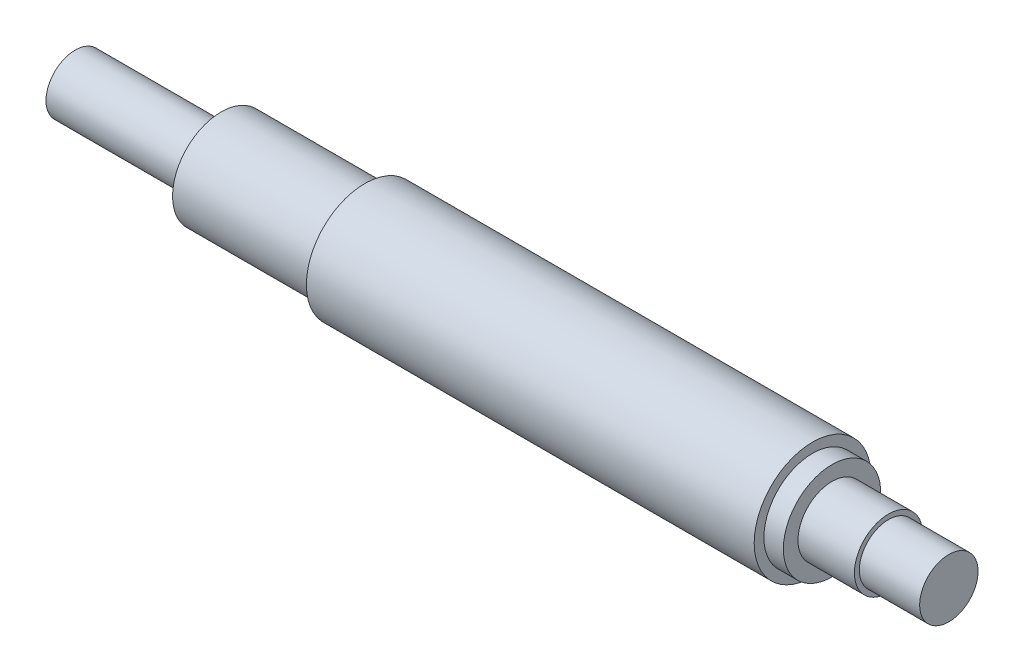
ISO-10303-21;
HEADER;
FILE_DESCRIPTION(('STEP AP214'),'2;1');
FILE_NAME('part.step','',(''),(''),'','','');
FILE_SCHEMA(('AUTOMOTIVE_DESIGN { 1 0 10303 214 1 1 1 1 }'));
ENDSEC;
DATA;
#1=APPLICATION_CONTEXT('core data for automotive mechanical design processes');
#2=APPLICATION_PROTOCOL_DEFINITION('international standard','automotive_design',2000,#1);
#3=PRODUCT_CONTEXT('',#1,'mechanical');
#4=PRODUCT('Part','Part','',(#3));
#5=PRODUCT_RELATED_PRODUCT_CATEGORY('part','',(#4));
#6=PRODUCT_DEFINITION_FORMATION('','',#4);
#7=PRODUCT_DEFINITION_CONTEXT('part definition',#1,'design');
#8=PRODUCT_DEFINITION('design','',#6,#7);
#9=PRODUCT_DEFINITION_SHAPE('','',#8);
#10=(LENGTH_UNIT() NAMED_UNIT(*) SI_UNIT(.MILLI.,.METRE.));
#11=(NAMED_UNIT(*) PLANE_ANGLE_UNIT() SI_UNIT($,.RADIAN.));
#12=(NAMED_UNIT(*) SI_UNIT($,.STERADIAN.) SOLID_ANGLE_UNIT());
#13=UNCERTAINTY_MEASURE_WITH_UNIT(LENGTH_MEASURE(1.E-05),#10,'distance_accuracy_value','');
#14=(GEOMETRIC_REPRESENTATION_CONTEXT(3) GLOBAL_UNCERTAINTY_ASSIGNED_CONTEXT((#13)) GLOBAL_UNIT_ASSIGNED_CONTEXT((#10,
#11,#12)) REPRESENTATION_CONTEXT('',''));
#15=CARTESIAN_POINT('',(0.,0.,0.));
#16=DIRECTION('',(0.,0.,1.));
#17=DIRECTION('',(1.,0.,0.));
#18=AXIS2_PLACEMENT_3D('',#15,#16,#17);
#19=CARTESIAN_POINT('',(-32.375,3.,0.));
#20=DIRECTION('',(1.,0.,0.));
#21=DIRECTION('',(0.,0.,-1.));
#22=AXIS2_PLACEMENT_3D('',#19,#20,#21);
#23=PLANE('',#22);
#24=CARTESIAN_POINT('',(-32.375,0.,0.));
#25=DIRECTION('',(-1.,0.,0.));
#26=DIRECTION('',(0.,0.,1.));
#27=AXIS2_PLACEMENT_3D('',#24,#25,#26);
#28=CIRCLE('',#27,3.);
#29=CARTESIAN_POINT('',(-32.375,0.,3.));
#30=VERTEX_POINT('',#29);
#31=EDGE_CURVE('E77',#30,#30,#28,.T.);
#32=ORIENTED_EDGE('',*,*,#31,.F.);
#33=EDGE_LOOP('',(#32));
#34=FACE_BOUND('',#33,.T.);
#35=CARTESIAN_POINT('',(-32.375,0.,0.));
#36=DIRECTION('',(-1.,0.,0.));
#37=DIRECTION('',(0.,0.,1.));
#38=AXIS2_PLACEMENT_3D('',#35,#36,#37);
#39=CIRCLE('',#38,5.);
#40=CARTESIAN_POINT('',(-32.375,0.,5.));
#41=VERTEX_POINT('',#40);
#42=EDGE_CURVE('E10',#41,#41,#39,.T.);
#43=ORIENTED_EDGE('',*,*,#42,.T.);
#44=EDGE_LOOP('',(#43));
#45=FACE_BOUND('',#44,.T.);
#46=ADVANCED_FACE('F40',(#34,#45),#23,.F.);
#47=CARTESIAN_POINT('',(-42.375,0.,0.));
#48=DIRECTION('',(-1.,0.,0.));
#49=DIRECTION('',(0.,0.,1.));
#50=AXIS2_PLACEMENT_3D('',#47,#48,#49);
#51=CYLINDRICAL_SURFACE('',#50,5.);
#52=ORIENTED_EDGE('',*,*,#42,.F.);
#53=EDGE_LOOP('',(#52));
#54=FACE_BOUND('',#53,.T.);
#55=CARTESIAN_POINT('',(-17.625,0.,0.));
#56=DIRECTION('',(-1.,0.,0.));
#57=DIRECTION('',(0.,0.,1.));
#58=AXIS2_PLACEMENT_3D('',#55,#56,#57);
#59=CIRCLE('',#58,5.);
#60=CARTESIAN_POINT('',(-17.625,0.,5.));
#61=VERTEX_POINT('',#60);
#62=EDGE_CURVE('E46',#61,#61,#59,.T.);
#63=ORIENTED_EDGE('',*,*,#62,.T.);
#64=EDGE_LOOP('',(#63));
#65=FACE_BOUND('',#64,.T.);
#66=ADVANCED_FACE('F100',(#54,#65),#51,.T.);
#67=CARTESIAN_POINT('',(-17.625,5.,0.));
#68=DIRECTION('',(1.,0.,0.));
#69=DIRECTION('',(0.,0.,-1.));
#70=AXIS2_PLACEMENT_3D('',#67,#68,#69);
#71=PLANE('',#70);
#72=ORIENTED_EDGE('',*,*,#62,.F.);
#73=EDGE_LOOP('',(#72));
#74=FACE_BOUND('',#73,.T.);
#75=CARTESIAN_POINT('',(-17.625,0.,0.));
#76=DIRECTION('',(-1.,0.,0.));
#77=DIRECTION('',(0.,0.,1.));
#78=AXIS2_PLACEMENT_3D('',#75,#76,#77);
#79=CIRCLE('',#78,6.);
#80=CARTESIAN_POINT('',(-17.625,0.,6.));
#81=VERTEX_POINT('',#80);
#82=EDGE_CURVE('E50',#81,#81,#79,.T.);
#83=ORIENTED_EDGE('',*,*,#82,.T.);
#84=EDGE_LOOP('',(#83));
#85=FACE_BOUND('',#84,.T.);
#86=ADVANCED_FACE('F105',(#74,#85),#71,.F.);
#87=CARTESIAN_POINT('',(-42.375,0.,0.));
#88=DIRECTION('',(-1.,0.,0.));
#89=DIRECTION('',(0.,0.,1.));
#90=AXIS2_PLACEMENT_3D('',#87,#88,#89);
#91=CYLINDRICAL_SURFACE('',#90,6.);
#92=ORIENTED_EDGE('',*,*,#82,.F.);
#93=EDGE_LOOP('',(#92));
#94=FACE_BOUND('',#93,.T.);
#95=CARTESIAN_POINT('',(28.375,0.,0.));
#96=DIRECTION('',(-1.,0.,0.));
#97=DIRECTION('',(0.,0.,1.));
#98=AXIS2_PLACEMENT_3D('',#95,#96,#97);
#99=CIRCLE('',#98,5.99999999999999);
#100=CARTESIAN_POINT('',(28.375,0.,5.99999999999999));
#101=VERTEX_POINT('',#100);
#102=EDGE_CURVE('E54',#101,#101,#99,.T.);
#103=ORIENTED_EDGE('',*,*,#102,.T.);
#104=EDGE_LOOP('',(#103));
#105=FACE_BOUND('',#104,.T.);
#106=ADVANCED_FACE('F111',(#94,#105),#91,.T.);
#107=CARTESIAN_POINT('',(28.375,5.99999999999999,0.));
#108=DIRECTION('',(-1.,0.,0.));
#109=DIRECTION('',(0.,0.,1.));
#110=AXIS2_PLACEMENT_3D('',#107,#108,#109);
#111=PLANE('',#110);
#112=ORIENTED_EDGE('',*,*,#102,.F.);
#113=EDGE_LOOP('',(#112));
#114=FACE_BOUND('',#113,.T.);
#115=CARTESIAN_POINT('',(28.375,0.,0.));
#116=DIRECTION('',(-1.,0.,0.));
#117=DIRECTION('',(0.,0.,1.));
#118=AXIS2_PLACEMENT_3D('',#115,#116,#117);
#119=CIRCLE('',#118,4.99999999999998);
#120=CARTESIAN_POINT('',(28.375,0.,4.99999999999998));
#121=VERTEX_POINT('',#120);
#122=EDGE_CURVE('E59',#121,#121,#119,.T.);
#123=ORIENTED_EDGE('',*,*,#122,.T.);
#124=EDGE_LOOP('',(#123));
#125=FACE_BOUND('',#124,.T.);
#126=ADVANCED_FACE('F117',(#114,#125),#111,.F.);
#127=CARTESIAN_POINT('',(-42.375,0.,0.));
#128=DIRECTION('',(-1.,0.,0.));
#129=DIRECTION('',(0.,0.,1.));
#130=AXIS2_PLACEMENT_3D('',#127,#128,#129);
#131=CYLINDRICAL_SURFACE('',#130,4.99999999999998);
#132=ORIENTED_EDGE('',*,*,#122,.F.);
#133=EDGE_LOOP('',(#132));
#134=FACE_BOUND('',#133,.T.);
#135=CARTESIAN_POINT('',(30.375,0.,0.));
#136=DIRECTION('',(-1.,0.,0.));
#137=DIRECTION('',(0.,0.,1.));
#138=AXIS2_PLACEMENT_3D('',#135,#136,#137);
#139=CIRCLE('',#138,4.99999999999998);
#140=CARTESIAN_POINT('',(30.375,0.,4.99999999999998));
#141=VERTEX_POINT('',#140);
#142=EDGE_CURVE('E62',#141,#141,#139,.T.);
#143=ORIENTED_EDGE('',*,*,#142,.T.);
#144=EDGE_LOOP('',(#143));
#145=FACE_BOUND('',#144,.T.);
#146=ADVANCED_FACE('F121',(#134,#145),#131,.T.);
#147=CARTESIAN_POINT('',(30.375,4.99999999999998,0.));
#148=DIRECTION('',(-1.,0.,0.));
#149=DIRECTION('',(0.,0.,1.));
#150=AXIS2_PLACEMENT_3D('',#147,#148,#149);
#151=PLANE('',#150);
#152=ORIENTED_EDGE('',*,*,#142,.F.);
#153=EDGE_LOOP('',(#152));
#154=FACE_BOUND('',#153,.T.);
#155=CARTESIAN_POINT('',(30.375,0.,0.));
#156=DIRECTION('',(-1.,0.,0.));
#157=DIRECTION('',(0.,0.,1.));
#158=AXIS2_PLACEMENT_3D('',#155,#156,#157);
#159=CIRCLE('',#158,3.49999999999999);
#160=CARTESIAN_POINT('',(30.375,0.,3.49999999999999));
#161=VERTEX_POINT('',#160);
#162=EDGE_CURVE('E65',#161,#161,#159,.T.);
#163=ORIENTED_EDGE('',*,*,#162,.T.);
#164=EDGE_LOOP('',(#163));
#165=FACE_BOUND('',#164,.T.);
#166=ADVANCED_FACE('F125',(#154,#165),#151,.F.);
#167=CARTESIAN_POINT('',(-42.375,0.,0.));
#168=DIRECTION('',(-1.,0.,0.));
#169=DIRECTION('',(0.,0.,1.));
#170=AXIS2_PLACEMENT_3D('',#167,#168,#169);
#171=CYLINDRICAL_SURFACE('',#170,3.49999999999999);
#172=ORIENTED_EDGE('',*,*,#162,.F.);
#173=EDGE_LOOP('',(#172));
#174=FACE_BOUND('',#173,.T.);
#175=CARTESIAN_POINT('',(36.175,0.,0.));
#176=DIRECTION('',(-1.,0.,0.));
#177=DIRECTION('',(0.,0.,1.));
#178=AXIS2_PLACEMENT_3D('',#175,#176,#177);
#179=CIRCLE('',#178,3.49999999999999);
#180=CARTESIAN_POINT('',(36.175,0.,3.49999999999999));
#181=VERTEX_POINT('',#180);
#182=EDGE_CURVE('E68',#181,#181,#179,.T.);
#183=ORIENTED_EDGE('',*,*,#182,.T.);
#184=EDGE_LOOP('',(#183));
#185=FACE_BOUND('',#184,.T.);
#186=ADVANCED_FACE('F129',(#174,#185),#171,.T.);
#187=CARTESIAN_POINT('',(36.175,3.49999999999999,0.));
#188=DIRECTION('',(-1.,0.,0.));
#189=DIRECTION('',(0.,0.,1.));
#190=AXIS2_PLACEMENT_3D('',#187,#188,#189);
#191=PLANE('',#190);
#192=ORIENTED_EDGE('',*,*,#182,.F.);
#193=EDGE_LOOP('',(#192));
#194=FACE_BOUND('',#193,.T.);
#195=CARTESIAN_POINT('',(36.175,0.,0.));
#196=DIRECTION('',(-1.,0.,0.));
#197=DIRECTION('',(0.,0.,1.));
#198=AXIS2_PLACEMENT_3D('',#195,#196,#197);
#199=CIRCLE('',#198,2.99999999999999);
#200=CARTESIAN_POINT('',(36.175,0.,2.99999999999999));
#201=VERTEX_POINT('',#200);
#202=EDGE_CURVE('E71',#201,#201,#199,.T.);
#203=ORIENTED_EDGE('',*,*,#202,.T.);
#204=EDGE_LOOP('',(#203));
#205=FACE_BOUND('',#204,.T.);
#206=ADVANCED_FACE('F133',(#194,#205),#191,.F.);
#207=CARTESIAN_POINT('',(-42.375,0.,0.));
#208=DIRECTION('',(-1.,0.,0.));
#209=DIRECTION('',(0.,0.,1.));
#210=AXIS2_PLACEMENT_3D('',#207,#208,#209);
#211=CYLINDRICAL_SURFACE('',#210,2.99999999999999);
#212=ORIENTED_EDGE('',*,*,#202,.F.);
#213=EDGE_LOOP('',(#212));
#214=FACE_BOUND('',#213,.T.);
#215=CARTESIAN_POINT('',(42.375,0.,0.));
#216=DIRECTION('',(-1.,0.,0.));
#217=DIRECTION('',(0.,0.,1.));
#218=AXIS2_PLACEMENT_3D('',#215,#216,#217);
#219=CIRCLE('',#218,2.99999999999999);
#220=CARTESIAN_POINT('',(42.375,0.,2.99999999999999));
#221=VERTEX_POINT('',#220);
#222=EDGE_CURVE('E74',#221,#221,#219,.T.);
#223=ORIENTED_EDGE('',*,*,#222,.T.);
#224=EDGE_LOOP('',(#223));
#225=FACE_BOUND('',#224,.T.);
#226=ADVANCED_FACE('F96',(#214,#225),#211,.T.);
#227=CARTESIAN_POINT('',(42.375,2.99999999999999,0.));
#228=DIRECTION('',(-1.,0.,0.));
#229=DIRECTION('',(0.,0.,1.));
#230=AXIS2_PLACEMENT_3D('',#227,#228,#229);
#231=PLANE('',#230);
#232=ORIENTED_EDGE('',*,*,#222,.F.);
#233=EDGE_LOOP('',(#232));
#234=FACE_BOUND('',#233,.T.);
#235=ADVANCED_FACE('F88',(#234),#231,.F.);
#236=CARTESIAN_POINT('',(-42.375,0.,0.));
#237=DIRECTION('',(-1.,0.,0.));
#238=DIRECTION('',(0.,0.,1.));
#239=AXIS2_PLACEMENT_3D('',#236,#237,#238);
#240=CYLINDRICAL_SURFACE('',#239,3.);
#241=ORIENTED_EDGE('',*,*,#31,.T.);
#242=EDGE_LOOP('',(#241));
#243=FACE_BOUND('',#242,.T.);
#244=CARTESIAN_POINT('',(-47.375,0.,0.));
#245=DIRECTION('',(-1.,0.,0.));
#246=DIRECTION('',(0.,0.,1.));
#247=AXIS2_PLACEMENT_3D('',#244,#245,#246);
#248=CIRCLE('',#247,3.);
#249=CARTESIAN_POINT('',(-47.375,0.,3.));
#250=VERTEX_POINT('',#249);
#251=EDGE_CURVE('E80',#250,#250,#248,.T.);
#252=ORIENTED_EDGE('',*,*,#251,.F.);
#253=EDGE_LOOP('',(#252));
#254=FACE_BOUND('',#253,.T.);
#255=ADVANCED_FACE('F86',(#243,#254),#240,.T.);
#256=CARTESIAN_POINT('',(-47.375,0.,0.));
#257=DIRECTION('',(-1.,0.,0.));
#258=DIRECTION('',(0.,0.,1.));
#259=AXIS2_PLACEMENT_3D('',#256,#257,#258);
#260=PLANE('',#259);
#261=ORIENTED_EDGE('',*,*,#251,.T.);
#262=EDGE_LOOP('',(#261));
#263=FACE_BOUND('',#262,.T.);
#264=ADVANCED_FACE('F84',(#263),#260,.T.);
#265=CLOSED_SHELL('',(#46,#66,#86,#106,#126,#146,#166,#186,#206,#226,#235,#255,#264));
#266=MANIFOLD_SOLID_BREP('B2',#265);
#267=ADVANCED_BREP_SHAPE_REPRESENTATION('',(#18,#266),#14);
#268=SHAPE_DEFINITION_REPRESENTATION(#9,#267);
ENDSEC;
END-ISO-10303-21;
